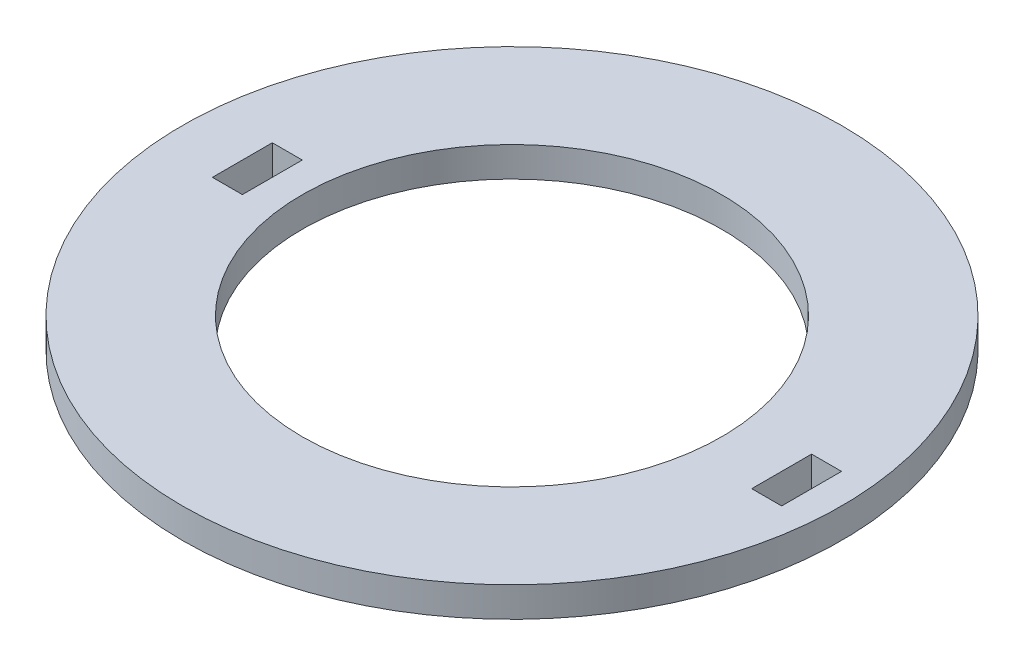
ISO-10303-21;
HEADER;
FILE_DESCRIPTION(('STEP AP214'),'2;1');
FILE_NAME('part.step','',(''),(''),'','','');
FILE_SCHEMA(('AUTOMOTIVE_DESIGN { 1 0 10303 214 1 1 1 1 }'));
ENDSEC;
DATA;
#1=APPLICATION_CONTEXT('core data for automotive mechanical design processes');
#2=APPLICATION_PROTOCOL_DEFINITION('international standard','automotive_design',2000,#1);
#3=PRODUCT_CONTEXT('',#1,'mechanical');
#4=PRODUCT('Part','Part','',(#3));
#5=PRODUCT_RELATED_PRODUCT_CATEGORY('part','',(#4));
#6=PRODUCT_DEFINITION_FORMATION('','',#4);
#7=PRODUCT_DEFINITION_CONTEXT('part definition',#1,'design');
#8=PRODUCT_DEFINITION('design','',#6,#7);
#9=PRODUCT_DEFINITION_SHAPE('','',#8);
#10=(LENGTH_UNIT() NAMED_UNIT(*) SI_UNIT(.MILLI.,.METRE.));
#11=(NAMED_UNIT(*) PLANE_ANGLE_UNIT() SI_UNIT($,.RADIAN.));
#12=(NAMED_UNIT(*) SI_UNIT($,.STERADIAN.) SOLID_ANGLE_UNIT());
#13=UNCERTAINTY_MEASURE_WITH_UNIT(LENGTH_MEASURE(1.E-05),#10,'distance_accuracy_value','');
#14=(GEOMETRIC_REPRESENTATION_CONTEXT(3) GLOBAL_UNCERTAINTY_ASSIGNED_CONTEXT((#13)) GLOBAL_UNIT_ASSIGNED_CONTEXT((#10,
#11,#12)) REPRESENTATION_CONTEXT('',''));
#15=CARTESIAN_POINT('',(0.,0.,0.));
#16=DIRECTION('',(0.,0.,1.));
#17=DIRECTION('',(1.,0.,0.));
#18=AXIS2_PLACEMENT_3D('',#15,#16,#17);
#19=CARTESIAN_POINT('',(0.,5.,0.));
#20=DIRECTION('',(0.,1.,0.));
#21=DIRECTION('',(0.,0.,1.));
#22=AXIS2_PLACEMENT_3D('',#19,#20,#21);
#23=PLANE('',#22);
#24=CARTESIAN_POINT('',(0.,5.,0.));
#25=DIRECTION('',(0.,1.,0.));
#26=DIRECTION('',(0.,0.,1.));
#27=AXIS2_PLACEMENT_3D('',#24,#25,#26);
#28=CIRCLE('',#27,55.);
#29=CARTESIAN_POINT('',(0.,5.,55.));
#30=VERTEX_POINT('',#29);
#31=EDGE_CURVE('E11',#30,#30,#28,.T.);
#32=ORIENTED_EDGE('',*,*,#31,.T.);
#33=EDGE_LOOP('',(#32));
#34=FACE_BOUND('',#33,.T.);
#35=CARTESIAN_POINT('',(0.,5.,0.));
#36=DIRECTION('',(0.,1.,0.));
#37=DIRECTION('',(0.,0.,1.));
#38=AXIS2_PLACEMENT_3D('',#35,#36,#37);
#39=CIRCLE('',#38,35.);
#40=CARTESIAN_POINT('',(0.,5.,35.));
#41=VERTEX_POINT('',#40);
#42=EDGE_CURVE('E166',#41,#41,#39,.T.);
#43=ORIENTED_EDGE('',*,*,#42,.F.);
#44=EDGE_LOOP('',(#43));
#45=FACE_BOUND('',#44,.T.);
#46=DIRECTION('',(0.,0.,-1.));
#47=VECTOR('',#46,1.);
#48=CARTESIAN_POINT('',(45.,5.,5.));
#49=LINE('',#48,#47);
#50=CARTESIAN_POINT('',(45.,5.,5.));
#51=VERTEX_POINT('',#50);
#52=CARTESIAN_POINT('',(45.,5.,-5.));
#53=VERTEX_POINT('',#52);
#54=EDGE_CURVE('E147',#51,#53,#49,.T.);
#55=ORIENTED_EDGE('',*,*,#54,.T.);
#56=DIRECTION('',(1.,0.,0.));
#57=VECTOR('',#56,1.);
#58=CARTESIAN_POINT('',(45.,5.,-5.));
#59=LINE('',#58,#57);
#60=CARTESIAN_POINT('',(50.,5.,-5.));
#61=VERTEX_POINT('',#60);
#62=EDGE_CURVE('E57',#53,#61,#59,.T.);
#63=ORIENTED_EDGE('',*,*,#62,.T.);
#64=DIRECTION('',(0.,0.,-1.));
#65=VECTOR('',#64,1.);
#66=CARTESIAN_POINT('',(50.,5.,5.));
#67=LINE('',#66,#65);
#68=CARTESIAN_POINT('',(50.,5.,5.));
#69=VERTEX_POINT('',#68);
#70=EDGE_CURVE('E154',#69,#61,#67,.T.);
#71=ORIENTED_EDGE('',*,*,#70,.F.);
#72=DIRECTION('',(1.,0.,0.));
#73=VECTOR('',#72,1.);
#74=CARTESIAN_POINT('',(45.,5.,5.));
#75=LINE('',#74,#73);
#76=EDGE_CURVE('E150',#51,#69,#75,.T.);
#77=ORIENTED_EDGE('',*,*,#76,.F.);
#78=EDGE_LOOP('',(#55,#63,#71,#77));
#79=FACE_BOUND('',#78,.T.);
#80=DIRECTION('',(0.,0.,-1.));
#81=VECTOR('',#80,1.);
#82=CARTESIAN_POINT('',(-45.,5.,5.));
#83=LINE('',#82,#81);
#84=CARTESIAN_POINT('',(-45.,5.,5.));
#85=VERTEX_POINT('',#84);
#86=CARTESIAN_POINT('',(-45.,5.,-5.));
#87=VERTEX_POINT('',#86);
#88=EDGE_CURVE('E109',#85,#87,#83,.T.);
#89=ORIENTED_EDGE('',*,*,#88,.T.);
#90=DIRECTION('',(1.,0.,0.));
#91=VECTOR('',#90,1.);
#92=CARTESIAN_POINT('',(-45.,5.,-5.));
#93=LINE('',#92,#91);
#94=CARTESIAN_POINT('',(-40.,5.,-5.));
#95=VERTEX_POINT('',#94);
#96=EDGE_CURVE('E49',#87,#95,#93,.T.);
#97=ORIENTED_EDGE('',*,*,#96,.T.);
#98=DIRECTION('',(0.,0.,-1.));
#99=VECTOR('',#98,1.);
#100=CARTESIAN_POINT('',(-40.,5.,5.));
#101=LINE('',#100,#99);
#102=CARTESIAN_POINT('',(-40.,5.,5.));
#103=VERTEX_POINT('',#102);
#104=EDGE_CURVE('E116',#103,#95,#101,.T.);
#105=ORIENTED_EDGE('',*,*,#104,.F.);
#106=DIRECTION('',(1.,0.,0.));
#107=VECTOR('',#106,1.);
#108=CARTESIAN_POINT('',(-45.,5.,5.));
#109=LINE('',#108,#107);
#110=EDGE_CURVE('E129',#85,#103,#109,.T.);
#111=ORIENTED_EDGE('',*,*,#110,.F.);
#112=EDGE_LOOP('',(#89,#97,#105,#111));
#113=FACE_BOUND('',#112,.T.);
#114=ADVANCED_FACE('F34',(#34,#45,#79,#113),#23,.T.);
#115=CARTESIAN_POINT('',(0.,0.,0.));
#116=DIRECTION('',(0.,1.,0.));
#117=DIRECTION('',(0.,0.,1.));
#118=AXIS2_PLACEMENT_3D('',#115,#116,#117);
#119=PLANE('',#118);
#120=DIRECTION('',(1.,0.,0.));
#121=VECTOR('',#120,1.);
#122=CARTESIAN_POINT('',(45.,0.,-5.));
#123=LINE('',#122,#121);
#124=CARTESIAN_POINT('',(45.,0.,-5.));
#125=VERTEX_POINT('',#124);
#126=CARTESIAN_POINT('',(50.,0.,-5.));
#127=VERTEX_POINT('',#126);
#128=EDGE_CURVE('E151',#125,#127,#123,.T.);
#129=ORIENTED_EDGE('',*,*,#128,.F.);
#130=DIRECTION('',(0.,0.,-1.));
#131=VECTOR('',#130,1.);
#132=CARTESIAN_POINT('',(45.,0.,5.));
#133=LINE('',#132,#131);
#134=CARTESIAN_POINT('',(45.,0.,5.));
#135=VERTEX_POINT('',#134);
#136=EDGE_CURVE('E146',#135,#125,#133,.T.);
#137=ORIENTED_EDGE('',*,*,#136,.F.);
#138=DIRECTION('',(1.,0.,0.));
#139=VECTOR('',#138,1.);
#140=CARTESIAN_POINT('',(45.,0.,5.));
#141=LINE('',#140,#139);
#142=CARTESIAN_POINT('',(50.,0.,5.));
#143=VERTEX_POINT('',#142);
#144=EDGE_CURVE('E159',#135,#143,#141,.T.);
#145=ORIENTED_EDGE('',*,*,#144,.T.);
#146=DIRECTION('',(0.,0.,-1.));
#147=VECTOR('',#146,1.);
#148=CARTESIAN_POINT('',(50.,0.,5.));
#149=LINE('',#148,#147);
#150=EDGE_CURVE('E162',#143,#127,#149,.T.);
#151=ORIENTED_EDGE('',*,*,#150,.T.);
#152=EDGE_LOOP('',(#129,#137,#145,#151));
#153=FACE_BOUND('',#152,.T.);
#154=CARTESIAN_POINT('',(0.,0.,0.));
#155=DIRECTION('',(0.,1.,0.));
#156=DIRECTION('',(0.,0.,1.));
#157=AXIS2_PLACEMENT_3D('',#154,#155,#156);
#158=CIRCLE('',#157,55.);
#159=CARTESIAN_POINT('',(0.,0.,55.));
#160=VERTEX_POINT('',#159);
#161=EDGE_CURVE('E38',#160,#160,#158,.T.);
#162=ORIENTED_EDGE('',*,*,#161,.F.);
#163=EDGE_LOOP('',(#162));
#164=FACE_BOUND('',#163,.T.);
#165=CARTESIAN_POINT('',(0.,0.,0.));
#166=DIRECTION('',(0.,1.,0.));
#167=DIRECTION('',(0.,0.,1.));
#168=AXIS2_PLACEMENT_3D('',#165,#166,#167);
#169=CIRCLE('',#168,35.);
#170=CARTESIAN_POINT('',(0.,0.,35.));
#171=VERTEX_POINT('',#170);
#172=EDGE_CURVE('E117',#171,#171,#169,.T.);
#173=ORIENTED_EDGE('',*,*,#172,.T.);
#174=EDGE_LOOP('',(#173));
#175=FACE_BOUND('',#174,.T.);
#176=DIRECTION('',(1.,0.,0.));
#177=VECTOR('',#176,1.);
#178=CARTESIAN_POINT('',(-45.,0.,-5.));
#179=LINE('',#178,#177);
#180=CARTESIAN_POINT('',(-45.,0.,-5.));
#181=VERTEX_POINT('',#180);
#182=CARTESIAN_POINT('',(-40.,0.,-5.));
#183=VERTEX_POINT('',#182);
#184=EDGE_CURVE('E99',#181,#183,#179,.T.);
#185=ORIENTED_EDGE('',*,*,#184,.F.);
#186=DIRECTION('',(0.,0.,-1.));
#187=VECTOR('',#186,1.);
#188=CARTESIAN_POINT('',(-45.,0.,5.));
#189=LINE('',#188,#187);
#190=CARTESIAN_POINT('',(-45.,0.,5.));
#191=VERTEX_POINT('',#190);
#192=EDGE_CURVE('E123',#191,#181,#189,.T.);
#193=ORIENTED_EDGE('',*,*,#192,.F.);
#194=DIRECTION('',(1.,0.,0.));
#195=VECTOR('',#194,1.);
#196=CARTESIAN_POINT('',(-45.,0.,5.));
#197=LINE('',#196,#195);
#198=CARTESIAN_POINT('',(-40.,0.,5.));
#199=VERTEX_POINT('',#198);
#200=EDGE_CURVE('E121',#191,#199,#197,.T.);
#201=ORIENTED_EDGE('',*,*,#200,.T.);
#202=DIRECTION('',(0.,0.,-1.));
#203=VECTOR('',#202,1.);
#204=CARTESIAN_POINT('',(-40.,0.,5.));
#205=LINE('',#204,#203);
#206=EDGE_CURVE('E108',#199,#183,#205,.T.);
#207=ORIENTED_EDGE('',*,*,#206,.T.);
#208=EDGE_LOOP('',(#185,#193,#201,#207));
#209=FACE_BOUND('',#208,.T.);
#210=ADVANCED_FACE('F120',(#153,#164,#175,#209),#119,.F.);
#211=CARTESIAN_POINT('',(0.,5.,0.));
#212=DIRECTION('',(0.,-1.,0.));
#213=DIRECTION('',(0.,0.,-1.));
#214=AXIS2_PLACEMENT_3D('',#211,#212,#213);
#215=CYLINDRICAL_SURFACE('',#214,55.);
#216=ORIENTED_EDGE('',*,*,#31,.F.);
#217=EDGE_LOOP('',(#216));
#218=FACE_BOUND('',#217,.T.);
#219=ORIENTED_EDGE('',*,*,#161,.T.);
#220=EDGE_LOOP('',(#219));
#221=FACE_BOUND('',#220,.T.);
#222=ADVANCED_FACE('F36',(#218,#221),#215,.T.);
#223=CARTESIAN_POINT('',(0.,5.,0.));
#224=DIRECTION('',(0.,-1.,0.));
#225=DIRECTION('',(0.,0.,-1.));
#226=AXIS2_PLACEMENT_3D('',#223,#224,#225);
#227=CYLINDRICAL_SURFACE('',#226,35.);
#228=ORIENTED_EDGE('',*,*,#42,.T.);
#229=EDGE_LOOP('',(#228));
#230=FACE_BOUND('',#229,.T.);
#231=ORIENTED_EDGE('',*,*,#172,.F.);
#232=EDGE_LOOP('',(#231));
#233=FACE_BOUND('',#232,.T.);
#234=ADVANCED_FACE('F173',(#230,#233),#227,.F.);
#235=CARTESIAN_POINT('',(45.,0.,-5.));
#236=DIRECTION('',(0.,0.,1.));
#237=DIRECTION('',(1.,0.,0.));
#238=AXIS2_PLACEMENT_3D('',#235,#236,#237);
#239=PLANE('',#238);
#240=ORIENTED_EDGE('',*,*,#62,.F.);
#241=DIRECTION('',(0.,1.,0.));
#242=VECTOR('',#241,1.);
#243=CARTESIAN_POINT('',(45.,0.,-5.));
#244=LINE('',#243,#242);
#245=EDGE_CURVE('E144',#125,#53,#244,.T.);
#246=ORIENTED_EDGE('',*,*,#245,.F.);
#247=ORIENTED_EDGE('',*,*,#128,.T.);
#248=DIRECTION('',(0.,1.,0.));
#249=VECTOR('',#248,1.);
#250=CARTESIAN_POINT('',(50.,0.,-5.));
#251=LINE('',#250,#249);
#252=EDGE_CURVE('E138',#127,#61,#251,.T.);
#253=ORIENTED_EDGE('',*,*,#252,.T.);
#254=EDGE_LOOP('',(#240,#246,#247,#253));
#255=FACE_BOUND('',#254,.T.);
#256=ADVANCED_FACE('F175',(#255),#239,.T.);
#257=CARTESIAN_POINT('',(50.,0.,5.));
#258=DIRECTION('',(1.,0.,0.));
#259=DIRECTION('',(0.,0.,-1.));
#260=AXIS2_PLACEMENT_3D('',#257,#258,#259);
#261=PLANE('',#260);
#262=ORIENTED_EDGE('',*,*,#70,.T.);
#263=ORIENTED_EDGE('',*,*,#252,.F.);
#264=ORIENTED_EDGE('',*,*,#150,.F.);
#265=DIRECTION('',(0.,1.,0.));
#266=VECTOR('',#265,1.);
#267=CARTESIAN_POINT('',(50.,0.,5.));
#268=LINE('',#267,#266);
#269=EDGE_CURVE('E140',#143,#69,#268,.T.);
#270=ORIENTED_EDGE('',*,*,#269,.T.);
#271=EDGE_LOOP('',(#262,#263,#264,#270));
#272=FACE_BOUND('',#271,.T.);
#273=ADVANCED_FACE('F183',(#272),#261,.F.);
#274=CARTESIAN_POINT('',(45.,0.,5.));
#275=DIRECTION('',(0.,0.,1.));
#276=DIRECTION('',(1.,0.,0.));
#277=AXIS2_PLACEMENT_3D('',#274,#275,#276);
#278=PLANE('',#277);
#279=ORIENTED_EDGE('',*,*,#76,.T.);
#280=ORIENTED_EDGE('',*,*,#269,.F.);
#281=ORIENTED_EDGE('',*,*,#144,.F.);
#282=DIRECTION('',(0.,1.,0.));
#283=VECTOR('',#282,1.);
#284=CARTESIAN_POINT('',(45.,0.,5.));
#285=LINE('',#284,#283);
#286=EDGE_CURVE('E142',#135,#51,#285,.T.);
#287=ORIENTED_EDGE('',*,*,#286,.T.);
#288=EDGE_LOOP('',(#279,#280,#281,#287));
#289=FACE_BOUND('',#288,.T.);
#290=ADVANCED_FACE('F222',(#289),#278,.F.);
#291=CARTESIAN_POINT('',(45.,0.,5.));
#292=DIRECTION('',(1.,0.,0.));
#293=DIRECTION('',(0.,0.,-1.));
#294=AXIS2_PLACEMENT_3D('',#291,#292,#293);
#295=PLANE('',#294);
#296=ORIENTED_EDGE('',*,*,#54,.F.);
#297=ORIENTED_EDGE('',*,*,#286,.F.);
#298=ORIENTED_EDGE('',*,*,#136,.T.);
#299=ORIENTED_EDGE('',*,*,#245,.T.);
#300=EDGE_LOOP('',(#296,#297,#298,#299));
#301=FACE_BOUND('',#300,.T.);
#302=ADVANCED_FACE('F218',(#301),#295,.T.);
#303=CARTESIAN_POINT('',(-45.,0.,-5.));
#304=DIRECTION('',(0.,0.,1.));
#305=DIRECTION('',(1.,0.,0.));
#306=AXIS2_PLACEMENT_3D('',#303,#304,#305);
#307=PLANE('',#306);
#308=ORIENTED_EDGE('',*,*,#96,.F.);
#309=DIRECTION('',(0.,1.,0.));
#310=VECTOR('',#309,1.);
#311=CARTESIAN_POINT('',(-45.,0.,-5.));
#312=LINE('',#311,#310);
#313=EDGE_CURVE('E104',#181,#87,#312,.T.);
#314=ORIENTED_EDGE('',*,*,#313,.F.);
#315=ORIENTED_EDGE('',*,*,#184,.T.);
#316=DIRECTION('',(0.,1.,0.));
#317=VECTOR('',#316,1.);
#318=CARTESIAN_POINT('',(-40.,0.,-5.));
#319=LINE('',#318,#317);
#320=EDGE_CURVE('E102',#183,#95,#319,.T.);
#321=ORIENTED_EDGE('',*,*,#320,.T.);
#322=EDGE_LOOP('',(#308,#314,#315,#321));
#323=FACE_BOUND('',#322,.T.);
#324=ADVANCED_FACE('F101',(#323),#307,.T.);
#325=CARTESIAN_POINT('',(-40.,0.,5.));
#326=DIRECTION('',(1.,0.,0.));
#327=DIRECTION('',(0.,0.,-1.));
#328=AXIS2_PLACEMENT_3D('',#325,#326,#327);
#329=PLANE('',#328);
#330=ORIENTED_EDGE('',*,*,#104,.T.);
#331=ORIENTED_EDGE('',*,*,#320,.F.);
#332=ORIENTED_EDGE('',*,*,#206,.F.);
#333=DIRECTION('',(0.,1.,0.));
#334=VECTOR('',#333,1.);
#335=CARTESIAN_POINT('',(-40.,0.,5.));
#336=LINE('',#335,#334);
#337=EDGE_CURVE('E118',#199,#103,#336,.T.);
#338=ORIENTED_EDGE('',*,*,#337,.T.);
#339=EDGE_LOOP('',(#330,#331,#332,#338));
#340=FACE_BOUND('',#339,.T.);
#341=ADVANCED_FACE('F113',(#340),#329,.F.);
#342=CARTESIAN_POINT('',(-45.,0.,5.));
#343=DIRECTION('',(0.,0.,1.));
#344=DIRECTION('',(1.,0.,0.));
#345=AXIS2_PLACEMENT_3D('',#342,#343,#344);
#346=PLANE('',#345);
#347=ORIENTED_EDGE('',*,*,#110,.T.);
#348=ORIENTED_EDGE('',*,*,#337,.F.);
#349=ORIENTED_EDGE('',*,*,#200,.F.);
#350=DIRECTION('',(0.,1.,0.));
#351=VECTOR('',#350,1.);
#352=CARTESIAN_POINT('',(-45.,0.,5.));
#353=LINE('',#352,#351);
#354=EDGE_CURVE('E135',#191,#85,#353,.T.);
#355=ORIENTED_EDGE('',*,*,#354,.T.);
#356=EDGE_LOOP('',(#347,#348,#349,#355));
#357=FACE_BOUND('',#356,.T.);
#358=ADVANCED_FACE('F207',(#357),#346,.F.);
#359=CARTESIAN_POINT('',(-45.,0.,5.));
#360=DIRECTION('',(1.,0.,0.));
#361=DIRECTION('',(0.,0.,-1.));
#362=AXIS2_PLACEMENT_3D('',#359,#360,#361);
#363=PLANE('',#362);
#364=ORIENTED_EDGE('',*,*,#88,.F.);
#365=ORIENTED_EDGE('',*,*,#354,.F.);
#366=ORIENTED_EDGE('',*,*,#192,.T.);
#367=ORIENTED_EDGE('',*,*,#313,.T.);
#368=EDGE_LOOP('',(#364,#365,#366,#367));
#369=FACE_BOUND('',#368,.T.);
#370=ADVANCED_FACE('F205',(#369),#363,.T.);
#371=CLOSED_SHELL('',(#114,#210,#222,#234,#256,#273,#290,#302,#324,#341,#358,#370));
#372=MANIFOLD_SOLID_BREP('B2',#371);
#373=ADVANCED_BREP_SHAPE_REPRESENTATION('',(#18,#372),#14);
#374=SHAPE_DEFINITION_REPRESENTATION(#9,#373);
ENDSEC;
END-ISO-10303-21;
